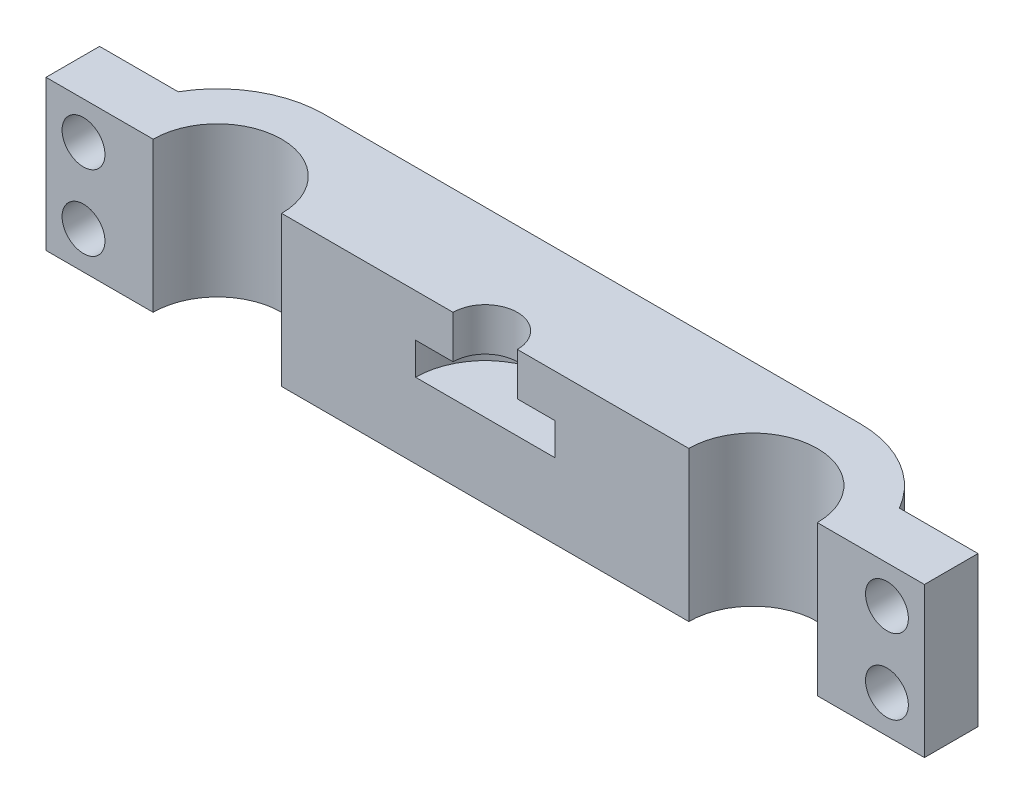
ISO-10303-21;
HEADER;
FILE_DESCRIPTION(('STEP AP214'),'2;1');
FILE_NAME('part.step','',(''),(''),'','','');
FILE_SCHEMA(('AUTOMOTIVE_DESIGN { 1 0 10303 214 1 1 1 1 }'));
ENDSEC;
DATA;
#1=APPLICATION_CONTEXT('core data for automotive mechanical design processes');
#2=APPLICATION_PROTOCOL_DEFINITION('international standard','automotive_design',2000,#1);
#3=PRODUCT_CONTEXT('',#1,'mechanical');
#4=PRODUCT('Part','Part','',(#3));
#5=PRODUCT_RELATED_PRODUCT_CATEGORY('part','',(#4));
#6=PRODUCT_DEFINITION_FORMATION('','',#4);
#7=PRODUCT_DEFINITION_CONTEXT('part definition',#1,'design');
#8=PRODUCT_DEFINITION('design','',#6,#7);
#9=PRODUCT_DEFINITION_SHAPE('','',#8);
#10=(LENGTH_UNIT() NAMED_UNIT(*) SI_UNIT(.MILLI.,.METRE.));
#11=(NAMED_UNIT(*) PLANE_ANGLE_UNIT() SI_UNIT($,.RADIAN.));
#12=(NAMED_UNIT(*) SI_UNIT($,.STERADIAN.) SOLID_ANGLE_UNIT());
#13=UNCERTAINTY_MEASURE_WITH_UNIT(LENGTH_MEASURE(1.E-05),#10,'distance_accuracy_value','');
#14=(GEOMETRIC_REPRESENTATION_CONTEXT(3) GLOBAL_UNCERTAINTY_ASSIGNED_CONTEXT((#13)) GLOBAL_UNIT_ASSIGNED_CONTEXT((#10,
#11,#12)) REPRESENTATION_CONTEXT('',''));
#15=CARTESIAN_POINT('',(0.,0.,0.));
#16=DIRECTION('',(0.,0.,1.));
#17=DIRECTION('',(1.,0.,0.));
#18=AXIS2_PLACEMENT_3D('',#15,#16,#17);
#19=CARTESIAN_POINT('',(3.,14.,0.));
#20=DIRECTION('',(0.,0.,-1.));
#21=DIRECTION('',(-1.,0.,0.));
#22=AXIS2_PLACEMENT_3D('',#19,#20,#21);
#23=PLANE('',#22);
#24=DIRECTION('',(-1.,0.,0.));
#25=VECTOR('',#24,1.);
#26=CARTESIAN_POINT('',(-4.68331613752354,7.,0.));
#27=LINE('',#26,#25);
#28=CARTESIAN_POINT('',(6.5,7.,0.));
#29=VERTEX_POINT('',#28);
#30=CARTESIAN_POINT('',(-6.5,7.,0.));
#31=VERTEX_POINT('',#30);
#32=EDGE_CURVE('E278',#29,#31,#27,.T.);
#33=ORIENTED_EDGE('',*,*,#32,.T.);
#34=DIRECTION('',(0.,1.,0.));
#35=VECTOR('',#34,1.);
#36=CARTESIAN_POINT('',(-6.5,7.,0.));
#37=LINE('',#36,#35);
#38=CARTESIAN_POINT('',(-6.5,10.,0.));
#39=VERTEX_POINT('',#38);
#40=EDGE_CURVE('E11',#31,#39,#37,.T.);
#41=ORIENTED_EDGE('',*,*,#40,.T.);
#42=DIRECTION('',(1.,0.,0.));
#43=VECTOR('',#42,1.);
#44=CARTESIAN_POINT('',(3.,10.,0.));
#45=LINE('',#44,#43);
#46=CARTESIAN_POINT('',(-3.,10.,0.));
#47=VERTEX_POINT('',#46);
#48=EDGE_CURVE('E54',#39,#47,#45,.T.);
#49=ORIENTED_EDGE('',*,*,#48,.T.);
#50=DIRECTION('',(0.,-1.,0.));
#51=VECTOR('',#50,1.);
#52=CARTESIAN_POINT('',(-3.,14.,0.));
#53=LINE('',#52,#51);
#54=CARTESIAN_POINT('',(-3.,14.,0.));
#55=VERTEX_POINT('',#54);
#56=EDGE_CURVE('E241',#55,#47,#53,.T.);
#57=ORIENTED_EDGE('',*,*,#56,.F.);
#58=DIRECTION('',(1.,0.,0.));
#59=VECTOR('',#58,1.);
#60=CARTESIAN_POINT('',(-3.,14.,0.));
#61=LINE('',#60,#59);
#62=CARTESIAN_POINT('',(-19.,14.,0.));
#63=VERTEX_POINT('',#62);
#64=EDGE_CURVE('E321',#63,#55,#61,.T.);
#65=ORIENTED_EDGE('',*,*,#64,.F.);
#66=DIRECTION('',(0.,-1.,0.));
#67=VECTOR('',#66,1.);
#68=CARTESIAN_POINT('',(-19.,14.,0.));
#69=LINE('',#68,#67);
#70=CARTESIAN_POINT('',(-19.,0.,0.));
#71=VERTEX_POINT('',#70);
#72=EDGE_CURVE('E245',#63,#71,#69,.T.);
#73=ORIENTED_EDGE('',*,*,#72,.T.);
#74=DIRECTION('',(1.,0.,0.));
#75=VECTOR('',#74,1.);
#76=CARTESIAN_POINT('',(3.,0.,0.));
#77=LINE('',#76,#75);
#78=CARTESIAN_POINT('',(19.,0.,0.));
#79=VERTEX_POINT('',#78);
#80=EDGE_CURVE('E213',#71,#79,#77,.T.);
#81=ORIENTED_EDGE('',*,*,#80,.T.);
#82=DIRECTION('',(0.,-1.,0.));
#83=VECTOR('',#82,1.);
#84=CARTESIAN_POINT('',(19.,14.,0.));
#85=LINE('',#84,#83);
#86=CARTESIAN_POINT('',(19.,14.,0.));
#87=VERTEX_POINT('',#86);
#88=EDGE_CURVE('E233',#87,#79,#85,.T.);
#89=ORIENTED_EDGE('',*,*,#88,.F.);
#90=DIRECTION('',(1.,0.,0.));
#91=VECTOR('',#90,1.);
#92=CARTESIAN_POINT('',(3.,14.,0.));
#93=LINE('',#92,#91);
#94=CARTESIAN_POINT('',(3.,14.,0.));
#95=VERTEX_POINT('',#94);
#96=EDGE_CURVE('E320',#95,#87,#93,.T.);
#97=ORIENTED_EDGE('',*,*,#96,.F.);
#98=DIRECTION('',(0.,-1.,0.));
#99=VECTOR('',#98,1.);
#100=CARTESIAN_POINT('',(3.,14.,0.));
#101=LINE('',#100,#99);
#102=CARTESIAN_POINT('',(3.,10.,0.));
#103=VERTEX_POINT('',#102);
#104=EDGE_CURVE('E237',#95,#103,#101,.T.);
#105=ORIENTED_EDGE('',*,*,#104,.T.);
#106=CARTESIAN_POINT('',(6.5,10.,0.));
#107=VERTEX_POINT('',#106);
#108=EDGE_CURVE('E272',#103,#107,#45,.T.);
#109=ORIENTED_EDGE('',*,*,#108,.T.);
#110=DIRECTION('',(0.,1.,0.));
#111=VECTOR('',#110,1.);
#112=CARTESIAN_POINT('',(6.5,7.,0.));
#113=LINE('',#112,#111);
#114=EDGE_CURVE('E295',#107,#29,#113,.F.);
#115=ORIENTED_EDGE('',*,*,#114,.T.);
#116=EDGE_LOOP('',(#33,#41,#49,#57,#65,#73,#81,#89,#97,#105,#109,#115));
#117=FACE_BOUND('',#116,.T.);
#118=ADVANCED_FACE('F45',(#117),#23,.F.);
#119=CARTESIAN_POINT('',(25.,14.,0.));
#120=DIRECTION('',(0.,-1.,0.));
#121=DIRECTION('',(0.,0.,-1.));
#122=AXIS2_PLACEMENT_3D('',#119,#120,#121);
#123=CYLINDRICAL_SURFACE('',#122,10.);
#124=CARTESIAN_POINT('',(25.,0.,0.));
#125=DIRECTION('',(0.,1.,0.));
#126=DIRECTION('',(0.,0.,1.));
#127=AXIS2_PLACEMENT_3D('',#124,#125,#126);
#128=CIRCLE('',#127,10.);
#129=CARTESIAN_POINT('',(33.6602540378444,0.,-5.));
#130=VERTEX_POINT('',#129);
#131=CARTESIAN_POINT('',(25.,0.,-10.));
#132=VERTEX_POINT('',#131);
#133=EDGE_CURVE('E189',#130,#132,#128,.T.);
#134=ORIENTED_EDGE('',*,*,#133,.T.);
#135=DIRECTION('',(0.,-1.,0.));
#136=VECTOR('',#135,1.);
#137=CARTESIAN_POINT('',(25.,14.,-10.));
#138=LINE('',#137,#136);
#139=CARTESIAN_POINT('',(25.,14.,-10.));
#140=VERTEX_POINT('',#139);
#141=EDGE_CURVE('E269',#140,#132,#138,.T.);
#142=ORIENTED_EDGE('',*,*,#141,.F.);
#143=CARTESIAN_POINT('',(25.,14.,0.));
#144=DIRECTION('',(0.,1.,0.));
#145=DIRECTION('',(0.,0.,1.));
#146=AXIS2_PLACEMENT_3D('',#143,#144,#145);
#147=CIRCLE('',#146,10.);
#148=CARTESIAN_POINT('',(33.6602540378444,14.,-5.));
#149=VERTEX_POINT('',#148);
#150=EDGE_CURVE('E226',#149,#140,#147,.T.);
#151=ORIENTED_EDGE('',*,*,#150,.F.);
#152=DIRECTION('',(0.,-1.,0.));
#153=VECTOR('',#152,1.);
#154=CARTESIAN_POINT('',(33.6602540378444,14.,-5.));
#155=LINE('',#154,#153);
#156=EDGE_CURVE('E185',#149,#130,#155,.T.);
#157=ORIENTED_EDGE('',*,*,#156,.T.);
#158=EDGE_LOOP('',(#134,#142,#151,#157));
#159=FACE_BOUND('',#158,.T.);
#160=ADVANCED_FACE('F47',(#159),#123,.T.);
#161=CARTESIAN_POINT('',(-25.,14.,-10.));
#162=DIRECTION('',(0.,0.,1.));
#163=DIRECTION('',(1.,0.,0.));
#164=AXIS2_PLACEMENT_3D('',#161,#162,#163);
#165=PLANE('',#164);
#166=DIRECTION('',(-1.,0.,0.));
#167=VECTOR('',#166,1.);
#168=CARTESIAN_POINT('',(-25.,0.,-10.));
#169=LINE('',#168,#167);
#170=CARTESIAN_POINT('',(-25.,0.,-10.));
#171=VERTEX_POINT('',#170);
#172=EDGE_CURVE('E193',#132,#171,#169,.T.);
#173=ORIENTED_EDGE('',*,*,#172,.T.);
#174=DIRECTION('',(0.,-1.,0.));
#175=VECTOR('',#174,1.);
#176=CARTESIAN_POINT('',(-25.,14.,-10.));
#177=LINE('',#176,#175);
#178=CARTESIAN_POINT('',(-25.,14.,-10.));
#179=VERTEX_POINT('',#178);
#180=EDGE_CURVE('E265',#179,#171,#177,.T.);
#181=ORIENTED_EDGE('',*,*,#180,.F.);
#182=DIRECTION('',(-1.,0.,0.));
#183=VECTOR('',#182,1.);
#184=CARTESIAN_POINT('',(-25.,14.,-10.));
#185=LINE('',#184,#183);
#186=EDGE_CURVE('E124',#140,#179,#185,.T.);
#187=ORIENTED_EDGE('',*,*,#186,.F.);
#188=ORIENTED_EDGE('',*,*,#141,.T.);
#189=EDGE_LOOP('',(#173,#181,#187,#188));
#190=FACE_BOUND('',#189,.T.);
#191=ADVANCED_FACE('F391',(#190),#165,.F.);
#192=CARTESIAN_POINT('',(-25.,14.,0.));
#193=DIRECTION('',(0.,-1.,0.));
#194=DIRECTION('',(0.,0.,-1.));
#195=AXIS2_PLACEMENT_3D('',#192,#193,#194);
#196=CYLINDRICAL_SURFACE('',#195,10.);
#197=CARTESIAN_POINT('',(-25.,0.,0.));
#198=DIRECTION('',(0.,1.,0.));
#199=DIRECTION('',(0.,0.,1.));
#200=AXIS2_PLACEMENT_3D('',#197,#198,#199);
#201=CIRCLE('',#200,10.);
#202=CARTESIAN_POINT('',(-33.6602540378444,0.,-5.));
#203=VERTEX_POINT('',#202);
#204=EDGE_CURVE('E197',#171,#203,#201,.T.);
#205=ORIENTED_EDGE('',*,*,#204,.T.);
#206=DIRECTION('',(0.,-1.,0.));
#207=VECTOR('',#206,1.);
#208=CARTESIAN_POINT('',(-33.6602540378444,14.,-5.));
#209=LINE('',#208,#207);
#210=CARTESIAN_POINT('',(-33.6602540378444,14.,-5.));
#211=VERTEX_POINT('',#210);
#212=EDGE_CURVE('E261',#211,#203,#209,.T.);
#213=ORIENTED_EDGE('',*,*,#212,.F.);
#214=CARTESIAN_POINT('',(-25.,14.,0.));
#215=DIRECTION('',(0.,1.,0.));
#216=DIRECTION('',(0.,0.,1.));
#217=AXIS2_PLACEMENT_3D('',#214,#215,#216);
#218=CIRCLE('',#217,10.);
#219=EDGE_CURVE('E341',#179,#211,#218,.T.);
#220=ORIENTED_EDGE('',*,*,#219,.F.);
#221=ORIENTED_EDGE('',*,*,#180,.T.);
#222=EDGE_LOOP('',(#205,#213,#220,#221));
#223=FACE_BOUND('',#222,.T.);
#224=ADVANCED_FACE('F394',(#223),#196,.T.);
#225=CARTESIAN_POINT('',(-41.,14.,-5.));
#226=DIRECTION('',(0.,0.,1.));
#227=DIRECTION('',(1.,0.,0.));
#228=AXIS2_PLACEMENT_3D('',#225,#226,#227);
#229=PLANE('',#228);
#230=CARTESIAN_POINT('',(-37.5,3.5,-5.));
#231=DIRECTION('',(0.,0.,1.));
#232=DIRECTION('',(1.,0.,0.));
#233=AXIS2_PLACEMENT_3D('',#230,#231,#232);
#234=CIRCLE('',#233,2.);
#235=CARTESIAN_POINT('',(-35.5,3.5,-5.));
#236=VERTEX_POINT('',#235);
#237=EDGE_CURVE('E194',#236,#236,#234,.T.);
#238=ORIENTED_EDGE('',*,*,#237,.T.);
#239=EDGE_LOOP('',(#238));
#240=FACE_BOUND('',#239,.T.);
#241=CARTESIAN_POINT('',(-37.5,10.5,-5.));
#242=DIRECTION('',(0.,0.,1.));
#243=DIRECTION('',(1.,0.,0.));
#244=AXIS2_PLACEMENT_3D('',#241,#242,#243);
#245=CIRCLE('',#244,2.);
#246=CARTESIAN_POINT('',(-35.5,10.5,-5.));
#247=VERTEX_POINT('',#246);
#248=EDGE_CURVE('E288',#247,#247,#245,.T.);
#249=ORIENTED_EDGE('',*,*,#248,.T.);
#250=EDGE_LOOP('',(#249));
#251=FACE_BOUND('',#250,.T.);
#252=DIRECTION('',(-1.,0.,0.));
#253=VECTOR('',#252,1.);
#254=CARTESIAN_POINT('',(-41.,0.,-5.));
#255=LINE('',#254,#253);
#256=CARTESIAN_POINT('',(-41.,0.,-5.));
#257=VERTEX_POINT('',#256);
#258=EDGE_CURVE('E200',#203,#257,#255,.T.);
#259=ORIENTED_EDGE('',*,*,#258,.T.);
#260=DIRECTION('',(0.,-1.,0.));
#261=VECTOR('',#260,1.);
#262=CARTESIAN_POINT('',(-41.,14.,-5.));
#263=LINE('',#262,#261);
#264=CARTESIAN_POINT('',(-41.,14.,-5.));
#265=VERTEX_POINT('',#264);
#266=EDGE_CURVE('E257',#265,#257,#263,.T.);
#267=ORIENTED_EDGE('',*,*,#266,.F.);
#268=DIRECTION('',(-1.,0.,0.));
#269=VECTOR('',#268,1.);
#270=CARTESIAN_POINT('',(-41.,14.,-5.));
#271=LINE('',#270,#269);
#272=EDGE_CURVE('E338',#211,#265,#271,.T.);
#273=ORIENTED_EDGE('',*,*,#272,.F.);
#274=ORIENTED_EDGE('',*,*,#212,.T.);
#275=EDGE_LOOP('',(#259,#267,#273,#274));
#276=FACE_BOUND('',#275,.T.);
#277=ADVANCED_FACE('F399',(#240,#251,#276),#229,.F.);
#278=CARTESIAN_POINT('',(-41.,14.,0.));
#279=DIRECTION('',(1.,0.,0.));
#280=DIRECTION('',(0.,0.,-1.));
#281=AXIS2_PLACEMENT_3D('',#278,#279,#280);
#282=PLANE('',#281);
#283=DIRECTION('',(0.,0.,1.));
#284=VECTOR('',#283,1.);
#285=CARTESIAN_POINT('',(-41.,0.,0.));
#286=LINE('',#285,#284);
#287=CARTESIAN_POINT('',(-41.,0.,0.));
#288=VERTEX_POINT('',#287);
#289=EDGE_CURVE('E203',#257,#288,#286,.T.);
#290=ORIENTED_EDGE('',*,*,#289,.T.);
#291=DIRECTION('',(0.,-1.,0.));
#292=VECTOR('',#291,1.);
#293=CARTESIAN_POINT('',(-41.,14.,0.));
#294=LINE('',#293,#292);
#295=CARTESIAN_POINT('',(-41.,14.,0.));
#296=VERTEX_POINT('',#295);
#297=EDGE_CURVE('E253',#296,#288,#294,.T.);
#298=ORIENTED_EDGE('',*,*,#297,.F.);
#299=DIRECTION('',(0.,0.,1.));
#300=VECTOR('',#299,1.);
#301=CARTESIAN_POINT('',(-41.,14.,0.));
#302=LINE('',#301,#300);
#303=EDGE_CURVE('E335',#265,#296,#302,.T.);
#304=ORIENTED_EDGE('',*,*,#303,.F.);
#305=ORIENTED_EDGE('',*,*,#266,.T.);
#306=EDGE_LOOP('',(#290,#298,#304,#305));
#307=FACE_BOUND('',#306,.T.);
#308=ADVANCED_FACE('F405',(#307),#282,.F.);
#309=CARTESIAN_POINT('',(-31.,14.,0.));
#310=DIRECTION('',(0.,0.,-1.));
#311=DIRECTION('',(-1.,0.,0.));
#312=AXIS2_PLACEMENT_3D('',#309,#310,#311);
#313=PLANE('',#312);
#314=CARTESIAN_POINT('',(-37.5,3.5,0.));
#315=DIRECTION('',(0.,0.,-1.));
#316=DIRECTION('',(-1.,0.,0.));
#317=AXIS2_PLACEMENT_3D('',#314,#315,#316);
#318=CIRCLE('',#317,2.);
#319=CARTESIAN_POINT('',(-35.5,3.5,0.));
#320=VERTEX_POINT('',#319);
#321=EDGE_CURVE('E289',#320,#320,#318,.T.);
#322=ORIENTED_EDGE('',*,*,#321,.T.);
#323=EDGE_LOOP('',(#322));
#324=FACE_BOUND('',#323,.T.);
#325=CARTESIAN_POINT('',(-37.5,10.5,0.));
#326=DIRECTION('',(0.,0.,-1.));
#327=DIRECTION('',(-1.,0.,0.));
#328=AXIS2_PLACEMENT_3D('',#325,#326,#327);
#329=CIRCLE('',#328,2.);
#330=CARTESIAN_POINT('',(-35.5,10.5,0.));
#331=VERTEX_POINT('',#330);
#332=EDGE_CURVE('E284',#331,#331,#329,.T.);
#333=ORIENTED_EDGE('',*,*,#332,.T.);
#334=EDGE_LOOP('',(#333));
#335=FACE_BOUND('',#334,.T.);
#336=DIRECTION('',(1.,0.,0.));
#337=VECTOR('',#336,1.);
#338=CARTESIAN_POINT('',(-31.,0.,0.));
#339=LINE('',#338,#337);
#340=CARTESIAN_POINT('',(-31.,0.,0.));
#341=VERTEX_POINT('',#340);
#342=EDGE_CURVE('E206',#288,#341,#339,.T.);
#343=ORIENTED_EDGE('',*,*,#342,.T.);
#344=DIRECTION('',(0.,-1.,0.));
#345=VECTOR('',#344,1.);
#346=CARTESIAN_POINT('',(-31.,14.,0.));
#347=LINE('',#346,#345);
#348=CARTESIAN_POINT('',(-31.,14.,0.));
#349=VERTEX_POINT('',#348);
#350=EDGE_CURVE('E249',#349,#341,#347,.T.);
#351=ORIENTED_EDGE('',*,*,#350,.F.);
#352=DIRECTION('',(1.,0.,0.));
#353=VECTOR('',#352,1.);
#354=CARTESIAN_POINT('',(-31.,14.,0.));
#355=LINE('',#354,#353);
#356=EDGE_CURVE('E332',#296,#349,#355,.T.);
#357=ORIENTED_EDGE('',*,*,#356,.F.);
#358=ORIENTED_EDGE('',*,*,#297,.T.);
#359=EDGE_LOOP('',(#343,#351,#357,#358));
#360=FACE_BOUND('',#359,.T.);
#361=ADVANCED_FACE('F409',(#324,#335,#360),#313,.F.);
#362=CARTESIAN_POINT('',(-25.,14.,0.));
#363=DIRECTION('',(0.,-1.,0.));
#364=DIRECTION('',(0.,0.,-1.));
#365=AXIS2_PLACEMENT_3D('',#362,#363,#364);
#366=CYLINDRICAL_SURFACE('',#365,6.);
#367=CARTESIAN_POINT('',(-25.,0.,0.));
#368=DIRECTION('',(0.,-1.,0.));
#369=DIRECTION('',(0.,0.,1.));
#370=AXIS2_PLACEMENT_3D('',#367,#368,#369);
#371=CIRCLE('',#370,6.);
#372=EDGE_CURVE('E209',#341,#71,#371,.T.);
#373=ORIENTED_EDGE('',*,*,#372,.T.);
#374=ORIENTED_EDGE('',*,*,#72,.F.);
#375=CARTESIAN_POINT('',(-25.,14.,0.));
#376=DIRECTION('',(0.,-1.,0.));
#377=DIRECTION('',(0.,0.,1.));
#378=AXIS2_PLACEMENT_3D('',#375,#376,#377);
#379=CIRCLE('',#378,6.);
#380=EDGE_CURVE('E326',#349,#63,#379,.T.);
#381=ORIENTED_EDGE('',*,*,#380,.F.);
#382=ORIENTED_EDGE('',*,*,#350,.T.);
#383=EDGE_LOOP('',(#373,#374,#381,#382));
#384=FACE_BOUND('',#383,.T.);
#385=ADVANCED_FACE('F414',(#384),#366,.F.);
#386=CARTESIAN_POINT('',(0.,14.,0.));
#387=DIRECTION('',(0.,-1.,0.));
#388=DIRECTION('',(0.,0.,-1.));
#389=AXIS2_PLACEMENT_3D('',#386,#387,#388);
#390=CYLINDRICAL_SURFACE('',#389,3.);
#391=ORIENTED_EDGE('',*,*,#56,.T.);
#392=CARTESIAN_POINT('',(0.,10.,0.));
#393=DIRECTION('',(0.,1.,0.));
#394=DIRECTION('',(0.,0.,1.));
#395=AXIS2_PLACEMENT_3D('',#392,#393,#394);
#396=CIRCLE('',#395,3.);
#397=EDGE_CURVE('E316',#47,#103,#396,.F.);
#398=ORIENTED_EDGE('',*,*,#397,.T.);
#399=ORIENTED_EDGE('',*,*,#104,.F.);
#400=CARTESIAN_POINT('',(0.,14.,0.));
#401=DIRECTION('',(0.,-1.,0.));
#402=DIRECTION('',(0.,0.,1.));
#403=AXIS2_PLACEMENT_3D('',#400,#401,#402);
#404=CIRCLE('',#403,3.);
#405=EDGE_CURVE('E317',#55,#95,#404,.T.);
#406=ORIENTED_EDGE('',*,*,#405,.F.);
#407=EDGE_LOOP('',(#391,#398,#399,#406));
#408=FACE_BOUND('',#407,.T.);
#409=ADVANCED_FACE('F314',(#408),#390,.F.);
#410=CARTESIAN_POINT('',(25.,14.,0.));
#411=DIRECTION('',(0.,-1.,0.));
#412=DIRECTION('',(0.,0.,-1.));
#413=AXIS2_PLACEMENT_3D('',#410,#411,#412);
#414=CYLINDRICAL_SURFACE('',#413,6.);
#415=CARTESIAN_POINT('',(25.,0.,0.));
#416=DIRECTION('',(0.,-1.,0.));
#417=DIRECTION('',(0.,0.,1.));
#418=AXIS2_PLACEMENT_3D('',#415,#416,#417);
#419=CIRCLE('',#418,6.);
#420=CARTESIAN_POINT('',(31.,0.,0.));
#421=VERTEX_POINT('',#420);
#422=EDGE_CURVE('E216',#79,#421,#419,.T.);
#423=ORIENTED_EDGE('',*,*,#422,.T.);
#424=DIRECTION('',(0.,-1.,0.));
#425=VECTOR('',#424,1.);
#426=CARTESIAN_POINT('',(31.,14.,0.));
#427=LINE('',#426,#425);
#428=CARTESIAN_POINT('',(31.,14.,0.));
#429=VERTEX_POINT('',#428);
#430=EDGE_CURVE('E178',#429,#421,#427,.T.);
#431=ORIENTED_EDGE('',*,*,#430,.F.);
#432=CARTESIAN_POINT('',(25.,14.,0.));
#433=DIRECTION('',(0.,-1.,0.));
#434=DIRECTION('',(0.,0.,1.));
#435=AXIS2_PLACEMENT_3D('',#432,#433,#434);
#436=CIRCLE('',#435,6.);
#437=EDGE_CURVE('E164',#87,#429,#436,.T.);
#438=ORIENTED_EDGE('',*,*,#437,.F.);
#439=ORIENTED_EDGE('',*,*,#88,.T.);
#440=EDGE_LOOP('',(#423,#431,#438,#439));
#441=FACE_BOUND('',#440,.T.);
#442=ADVANCED_FACE('F381',(#441),#414,.F.);
#443=CARTESIAN_POINT('',(31.,14.,0.));
#444=DIRECTION('',(0.,0.,-1.));
#445=DIRECTION('',(-1.,0.,0.));
#446=AXIS2_PLACEMENT_3D('',#443,#444,#445);
#447=PLANE('',#446);
#448=CARTESIAN_POINT('',(37.5,10.5,0.));
#449=DIRECTION('',(0.,0.,-1.));
#450=DIRECTION('',(-1.,0.,0.));
#451=AXIS2_PLACEMENT_3D('',#448,#449,#450);
#452=CIRCLE('',#451,2.);
#453=CARTESIAN_POINT('',(39.5,10.5,0.));
#454=VERTEX_POINT('',#453);
#455=EDGE_CURVE('E283',#454,#454,#452,.T.);
#456=ORIENTED_EDGE('',*,*,#455,.T.);
#457=EDGE_LOOP('',(#456));
#458=FACE_BOUND('',#457,.T.);
#459=CARTESIAN_POINT('',(37.5,3.5,0.));
#460=DIRECTION('',(0.,0.,-1.));
#461=DIRECTION('',(-1.,0.,0.));
#462=AXIS2_PLACEMENT_3D('',#459,#460,#461);
#463=CIRCLE('',#462,2.);
#464=CARTESIAN_POINT('',(39.5,3.5,0.));
#465=VERTEX_POINT('',#464);
#466=EDGE_CURVE('E277',#465,#465,#463,.T.);
#467=ORIENTED_EDGE('',*,*,#466,.T.);
#468=EDGE_LOOP('',(#467));
#469=FACE_BOUND('',#468,.T.);
#470=DIRECTION('',(1.,0.,0.));
#471=VECTOR('',#470,1.);
#472=CARTESIAN_POINT('',(31.,0.,0.));
#473=LINE('',#472,#471);
#474=CARTESIAN_POINT('',(41.,0.,0.));
#475=VERTEX_POINT('',#474);
#476=EDGE_CURVE('E174',#421,#475,#473,.T.);
#477=ORIENTED_EDGE('',*,*,#476,.T.);
#478=DIRECTION('',(0.,-1.,0.));
#479=VECTOR('',#478,1.);
#480=CARTESIAN_POINT('',(41.,14.,0.));
#481=LINE('',#480,#479);
#482=CARTESIAN_POINT('',(41.,14.,0.));
#483=VERTEX_POINT('',#482);
#484=EDGE_CURVE('E171',#483,#475,#481,.T.);
#485=ORIENTED_EDGE('',*,*,#484,.F.);
#486=DIRECTION('',(1.,0.,0.));
#487=VECTOR('',#486,1.);
#488=CARTESIAN_POINT('',(31.,14.,0.));
#489=LINE('',#488,#487);
#490=EDGE_CURVE('E157',#429,#483,#489,.T.);
#491=ORIENTED_EDGE('',*,*,#490,.F.);
#492=ORIENTED_EDGE('',*,*,#430,.T.);
#493=EDGE_LOOP('',(#477,#485,#491,#492));
#494=FACE_BOUND('',#493,.T.);
#495=ADVANCED_FACE('F172',(#458,#469,#494),#447,.F.);
#496=CARTESIAN_POINT('',(41.,14.,0.));
#497=DIRECTION('',(-1.,0.,0.));
#498=DIRECTION('',(0.,0.,1.));
#499=AXIS2_PLACEMENT_3D('',#496,#497,#498);
#500=PLANE('',#499);
#501=DIRECTION('',(0.,0.,-1.));
#502=VECTOR('',#501,1.);
#503=CARTESIAN_POINT('',(41.,0.,0.));
#504=LINE('',#503,#502);
#505=CARTESIAN_POINT('',(41.,0.,-5.));
#506=VERTEX_POINT('',#505);
#507=EDGE_CURVE('E221',#475,#506,#504,.T.);
#508=ORIENTED_EDGE('',*,*,#507,.T.);
#509=DIRECTION('',(0.,-1.,0.));
#510=VECTOR('',#509,1.);
#511=CARTESIAN_POINT('',(41.,14.,-5.));
#512=LINE('',#511,#510);
#513=CARTESIAN_POINT('',(41.,14.,-5.));
#514=VERTEX_POINT('',#513);
#515=EDGE_CURVE('E179',#514,#506,#512,.T.);
#516=ORIENTED_EDGE('',*,*,#515,.F.);
#517=DIRECTION('',(0.,0.,-1.));
#518=VECTOR('',#517,1.);
#519=CARTESIAN_POINT('',(41.,14.,0.));
#520=LINE('',#519,#518);
#521=EDGE_CURVE('E161',#483,#514,#520,.T.);
#522=ORIENTED_EDGE('',*,*,#521,.F.);
#523=ORIENTED_EDGE('',*,*,#484,.T.);
#524=EDGE_LOOP('',(#508,#516,#522,#523));
#525=FACE_BOUND('',#524,.T.);
#526=ADVANCED_FACE('F181',(#525),#500,.F.);
#527=CARTESIAN_POINT('',(41.,14.,-5.));
#528=DIRECTION('',(0.,0.,1.));
#529=DIRECTION('',(1.,0.,0.));
#530=AXIS2_PLACEMENT_3D('',#527,#528,#529);
#531=PLANE('',#530);
#532=CARTESIAN_POINT('',(37.5,10.5,-5.));
#533=DIRECTION('',(0.,0.,1.));
#534=DIRECTION('',(1.,0.,0.));
#535=AXIS2_PLACEMENT_3D('',#532,#533,#534);
#536=CIRCLE('',#535,2.);
#537=CARTESIAN_POINT('',(39.5,10.5,-5.));
#538=VERTEX_POINT('',#537);
#539=EDGE_CURVE('E279',#538,#538,#536,.T.);
#540=ORIENTED_EDGE('',*,*,#539,.T.);
#541=EDGE_LOOP('',(#540));
#542=FACE_BOUND('',#541,.T.);
#543=CARTESIAN_POINT('',(37.5,3.5,-5.));
#544=DIRECTION('',(0.,0.,1.));
#545=DIRECTION('',(1.,0.,0.));
#546=AXIS2_PLACEMENT_3D('',#543,#544,#545);
#547=CIRCLE('',#546,2.);
#548=CARTESIAN_POINT('',(39.5,3.5,-5.));
#549=VERTEX_POINT('',#548);
#550=EDGE_CURVE('E273',#549,#549,#547,.T.);
#551=ORIENTED_EDGE('',*,*,#550,.T.);
#552=EDGE_LOOP('',(#551));
#553=FACE_BOUND('',#552,.T.);
#554=DIRECTION('',(-1.,0.,0.));
#555=VECTOR('',#554,1.);
#556=CARTESIAN_POINT('',(41.,0.,-5.));
#557=LINE('',#556,#555);
#558=EDGE_CURVE('E115',#506,#130,#557,.T.);
#559=ORIENTED_EDGE('',*,*,#558,.T.);
#560=ORIENTED_EDGE('',*,*,#156,.F.);
#561=DIRECTION('',(-1.,0.,0.));
#562=VECTOR('',#561,1.);
#563=CARTESIAN_POINT('',(41.,14.,-5.));
#564=LINE('',#563,#562);
#565=EDGE_CURVE('E70',#514,#149,#564,.T.);
#566=ORIENTED_EDGE('',*,*,#565,.F.);
#567=ORIENTED_EDGE('',*,*,#515,.T.);
#568=EDGE_LOOP('',(#559,#560,#566,#567));
#569=FACE_BOUND('',#568,.T.);
#570=ADVANCED_FACE('F385',(#542,#553,#569),#531,.F.);
#571=CARTESIAN_POINT('',(25.,14.,0.));
#572=DIRECTION('',(0.,1.,0.));
#573=DIRECTION('',(0.,0.,1.));
#574=AXIS2_PLACEMENT_3D('',#571,#572,#573);
#575=PLANE('',#574);
#576=ORIENTED_EDGE('',*,*,#150,.T.);
#577=ORIENTED_EDGE('',*,*,#186,.T.);
#578=ORIENTED_EDGE('',*,*,#219,.T.);
#579=ORIENTED_EDGE('',*,*,#272,.T.);
#580=ORIENTED_EDGE('',*,*,#303,.T.);
#581=ORIENTED_EDGE('',*,*,#356,.T.);
#582=ORIENTED_EDGE('',*,*,#380,.T.);
#583=ORIENTED_EDGE('',*,*,#64,.T.);
#584=ORIENTED_EDGE('',*,*,#405,.T.);
#585=ORIENTED_EDGE('',*,*,#96,.T.);
#586=ORIENTED_EDGE('',*,*,#437,.T.);
#587=ORIENTED_EDGE('',*,*,#490,.T.);
#588=ORIENTED_EDGE('',*,*,#521,.T.);
#589=ORIENTED_EDGE('',*,*,#565,.T.);
#590=EDGE_LOOP('',(#576,#577,#578,#579,#580,#581,#582,#583,#584,#585,#586,#587,#588,#589));
#591=FACE_BOUND('',#590,.T.);
#592=ADVANCED_FACE('F159',(#591),#575,.T.);
#593=CARTESIAN_POINT('',(25.,0.,0.));
#594=DIRECTION('',(0.,1.,0.));
#595=DIRECTION('',(0.,0.,1.));
#596=AXIS2_PLACEMENT_3D('',#593,#594,#595);
#597=PLANE('',#596);
#598=ORIENTED_EDGE('',*,*,#80,.F.);
#599=ORIENTED_EDGE('',*,*,#372,.F.);
#600=ORIENTED_EDGE('',*,*,#342,.F.);
#601=ORIENTED_EDGE('',*,*,#289,.F.);
#602=ORIENTED_EDGE('',*,*,#258,.F.);
#603=ORIENTED_EDGE('',*,*,#204,.F.);
#604=ORIENTED_EDGE('',*,*,#172,.F.);
#605=ORIENTED_EDGE('',*,*,#133,.F.);
#606=ORIENTED_EDGE('',*,*,#558,.F.);
#607=ORIENTED_EDGE('',*,*,#507,.F.);
#608=ORIENTED_EDGE('',*,*,#476,.F.);
#609=ORIENTED_EDGE('',*,*,#422,.F.);
#610=EDGE_LOOP('',(#598,#599,#600,#601,#602,#603,#604,#605,#606,#607,#608,#609));
#611=FACE_BOUND('',#610,.T.);
#612=ADVANCED_FACE('F383',(#611),#597,.F.);
#613=CARTESIAN_POINT('',(37.5,3.5,-10.));
#614=DIRECTION('',(0.,0.,1.));
#615=DIRECTION('',(1.,0.,0.));
#616=AXIS2_PLACEMENT_3D('',#613,#614,#615);
#617=CYLINDRICAL_SURFACE('',#616,2.);
#618=CARTESIAN_POINT('',(39.5,3.5,-5.));
#619=CARTESIAN_POINT('',(39.5,3.5,-4.94791666666667));
#620=CARTESIAN_POINT('',(39.5,3.5,-4.89583333333333));
#621=CARTESIAN_POINT('',(39.5,3.5,-4.79166666666667));
#622=CARTESIAN_POINT('',(39.5,3.5,-4.73958333333333));
#623=CARTESIAN_POINT('',(39.5,3.5,-4.63541666666667));
#624=CARTESIAN_POINT('',(39.5,3.5,-4.58333333333333));
#625=CARTESIAN_POINT('',(39.5,3.5,-4.47916666666667));
#626=CARTESIAN_POINT('',(39.5,3.5,-4.42708333333333));
#627=CARTESIAN_POINT('',(39.5,3.5,-4.32291666666667));
#628=CARTESIAN_POINT('',(39.5,3.5,-4.27083333333333));
#629=CARTESIAN_POINT('',(39.5,3.5,-4.16666666666667));
#630=CARTESIAN_POINT('',(39.5,3.5,-4.11458333333333));
#631=CARTESIAN_POINT('',(39.5,3.5,-4.01041666666667));
#632=CARTESIAN_POINT('',(39.5,3.5,-3.95833333333333));
#633=CARTESIAN_POINT('',(39.5,3.5,-3.85416666666667));
#634=CARTESIAN_POINT('',(39.5,3.5,-3.80208333333333));
#635=CARTESIAN_POINT('',(39.5,3.5,-3.69791666666667));
#636=CARTESIAN_POINT('',(39.5,3.5,-3.64583333333333));
#637=CARTESIAN_POINT('',(39.5,3.5,-3.54166666666667));
#638=CARTESIAN_POINT('',(39.5,3.5,-3.48958333333333));
#639=CARTESIAN_POINT('',(39.5,3.5,-3.38541666666667));
#640=CARTESIAN_POINT('',(39.5,3.5,-3.33333333333333));
#641=CARTESIAN_POINT('',(39.5,3.5,-3.22916666666667));
#642=CARTESIAN_POINT('',(39.5,3.5,-3.17708333333333));
#643=CARTESIAN_POINT('',(39.5,3.5,-3.07291666666667));
#644=CARTESIAN_POINT('',(39.5,3.5,-3.02083333333333));
#645=CARTESIAN_POINT('',(39.5,3.5,-2.91666666666667));
#646=CARTESIAN_POINT('',(39.5,3.5,-2.86458333333333));
#647=CARTESIAN_POINT('',(39.5,3.5,-2.76041666666667));
#648=CARTESIAN_POINT('',(39.5,3.5,-2.70833333333333));
#649=CARTESIAN_POINT('',(39.5,3.5,-2.60416666666667));
#650=CARTESIAN_POINT('',(39.5,3.5,-2.55208333333333));
#651=CARTESIAN_POINT('',(39.5,3.5,-2.44791666666667));
#652=CARTESIAN_POINT('',(39.5,3.5,-2.39583333333333));
#653=CARTESIAN_POINT('',(39.5,3.5,-2.29166666666667));
#654=CARTESIAN_POINT('',(39.5,3.5,-2.23958333333333));
#655=CARTESIAN_POINT('',(39.5,3.5,-2.13541666666667));
#656=CARTESIAN_POINT('',(39.5,3.5,-2.08333333333333));
#657=CARTESIAN_POINT('',(39.5,3.5,-1.97916666666667));
#658=CARTESIAN_POINT('',(39.5,3.5,-1.92708333333333));
#659=CARTESIAN_POINT('',(39.5,3.5,-1.82291666666667));
#660=CARTESIAN_POINT('',(39.5,3.5,-1.77083333333333));
#661=CARTESIAN_POINT('',(39.5,3.5,-1.66666666666667));
#662=CARTESIAN_POINT('',(39.5,3.5,-1.61458333333333));
#663=CARTESIAN_POINT('',(39.5,3.5,-1.51041666666667));
#664=CARTESIAN_POINT('',(39.5,3.5,-1.45833333333333));
#665=CARTESIAN_POINT('',(39.5,3.5,-1.35416666666667));
#666=CARTESIAN_POINT('',(39.5,3.5,-1.30208333333333));
#667=CARTESIAN_POINT('',(39.5,3.5,-1.19791666666667));
#668=CARTESIAN_POINT('',(39.5,3.5,-1.14583333333333));
#669=CARTESIAN_POINT('',(39.5,3.5,-1.04166666666667));
#670=CARTESIAN_POINT('',(39.5,3.5,-0.989583333333334));
#671=CARTESIAN_POINT('',(39.5,3.5,-0.885416666666668));
#672=CARTESIAN_POINT('',(39.5,3.5,-0.833333333333334));
#673=CARTESIAN_POINT('',(39.5,3.5,-0.729166666666667));
#674=CARTESIAN_POINT('',(39.5,3.5,-0.677083333333334));
#675=CARTESIAN_POINT('',(39.5,3.5,-0.572916666666667));
#676=CARTESIAN_POINT('',(39.5,3.5,-0.520833333333334));
#677=CARTESIAN_POINT('',(39.5,3.5,-0.416666666666667));
#678=CARTESIAN_POINT('',(39.5,3.5,-0.364583333333334));
#679=CARTESIAN_POINT('',(39.5,3.5,-0.260416666666667));
#680=CARTESIAN_POINT('',(39.5,3.5,-0.208333333333333));
#681=CARTESIAN_POINT('',(39.5,3.5,-0.104166666666667));
#682=CARTESIAN_POINT('',(39.5,3.5,-0.0520833333333334));
#683=CARTESIAN_POINT('',(39.5,3.5,0.));
#684=B_SPLINE_CURVE_WITH_KNOTS('',3,(#618,#619,#620,#621,#622,#623,#624,#625,#626,#627,#628,
#629,#630,#631,#632,#633,#634,#635,#636,#637,#638,#639,#640,#641,#642,#643,#644,#645,#646,#647,
#648,#649,#650,#651,#652,#653,#654,#655,#656,#657,#658,#659,#660,#661,#662,#663,#664,#665,#666,
#667,#668,#669,#670,#671,#672,#673,#674,#675,#676,#677,#678,#679,#680,#681,#682,#683),
.UNSPECIFIED.,.F.,.F.,(4,2,2,2,2,2,2,2,2,2,2,2,2,2,2,2,2,2,2,2,2,2,2,2,2,2,2,2,2,2,2,2,4),(0.,
0.15625,0.3125,0.46875,0.625000000000001,0.78125,0.9375,1.09375,1.25,1.40625,1.5625,1.71875,
1.875,2.03125,2.1875,2.34375,2.5,2.65625,2.8125,2.96875,3.125,3.28125,3.4375,3.59375,3.75,
3.90625,4.0625,4.21875,4.375,4.53125,4.6875,4.84375,5.),.UNSPECIFIED.);
#685=EDGE_CURVE('BSEAM443',#549,#465,#684,.T.);
#686=ORIENTED_EDGE('',*,*,#550,.F.);
#687=ORIENTED_EDGE('',*,*,#466,.F.);
#688=ORIENTED_EDGE('',*,*,#685,.T.);
#689=ORIENTED_EDGE('',*,*,#685,.F.);
#690=EDGE_LOOP('',(#686,#688,#687,#689));
#691=FACE_BOUND('',#690,.T.);
#692=ADVANCED_FACE('F443',(#691),#617,.F.);
#693=CARTESIAN_POINT('',(37.5,10.5,-10.));
#694=DIRECTION('',(0.,0.,1.));
#695=DIRECTION('',(1.,0.,0.));
#696=AXIS2_PLACEMENT_3D('',#693,#694,#695);
#697=CYLINDRICAL_SURFACE('',#696,2.);
#698=CARTESIAN_POINT('',(39.5,10.5,-5.));
#699=CARTESIAN_POINT('',(39.5,10.5,-4.94791666666667));
#700=CARTESIAN_POINT('',(39.5,10.5,-4.89583333333333));
#701=CARTESIAN_POINT('',(39.5,10.5,-4.79166666666667));
#702=CARTESIAN_POINT('',(39.5,10.5,-4.73958333333333));
#703=CARTESIAN_POINT('',(39.5,10.5,-4.63541666666667));
#704=CARTESIAN_POINT('',(39.5,10.5,-4.58333333333333));
#705=CARTESIAN_POINT('',(39.5,10.5,-4.47916666666667));
#706=CARTESIAN_POINT('',(39.5,10.5,-4.42708333333333));
#707=CARTESIAN_POINT('',(39.5,10.5,-4.32291666666667));
#708=CARTESIAN_POINT('',(39.5,10.5,-4.27083333333333));
#709=CARTESIAN_POINT('',(39.5,10.5,-4.16666666666667));
#710=CARTESIAN_POINT('',(39.5,10.5,-4.11458333333333));
#711=CARTESIAN_POINT('',(39.5,10.5,-4.01041666666667));
#712=CARTESIAN_POINT('',(39.5,10.5,-3.95833333333333));
#713=CARTESIAN_POINT('',(39.5,10.5,-3.85416666666667));
#714=CARTESIAN_POINT('',(39.5,10.5,-3.80208333333333));
#715=CARTESIAN_POINT('',(39.5,10.5,-3.69791666666667));
#716=CARTESIAN_POINT('',(39.5,10.5,-3.64583333333333));
#717=CARTESIAN_POINT('',(39.5,10.5,-3.54166666666667));
#718=CARTESIAN_POINT('',(39.5,10.5,-3.48958333333333));
#719=CARTESIAN_POINT('',(39.5,10.5,-3.38541666666667));
#720=CARTESIAN_POINT('',(39.5,10.5,-3.33333333333333));
#721=CARTESIAN_POINT('',(39.5,10.5,-3.22916666666667));
#722=CARTESIAN_POINT('',(39.5,10.5,-3.17708333333333));
#723=CARTESIAN_POINT('',(39.5,10.5,-3.07291666666667));
#724=CARTESIAN_POINT('',(39.5,10.5,-3.02083333333333));
#725=CARTESIAN_POINT('',(39.5,10.5,-2.91666666666667));
#726=CARTESIAN_POINT('',(39.5,10.5,-2.86458333333333));
#727=CARTESIAN_POINT('',(39.5,10.5,-2.76041666666667));
#728=CARTESIAN_POINT('',(39.5,10.5,-2.70833333333333));
#729=CARTESIAN_POINT('',(39.5,10.5,-2.60416666666667));
#730=CARTESIAN_POINT('',(39.5,10.5,-2.55208333333333));
#731=CARTESIAN_POINT('',(39.5,10.5,-2.44791666666667));
#732=CARTESIAN_POINT('',(39.5,10.5,-2.39583333333333));
#733=CARTESIAN_POINT('',(39.5,10.5,-2.29166666666667));
#734=CARTESIAN_POINT('',(39.5,10.5,-2.23958333333333));
#735=CARTESIAN_POINT('',(39.5,10.5,-2.13541666666667));
#736=CARTESIAN_POINT('',(39.5,10.5,-2.08333333333333));
#737=CARTESIAN_POINT('',(39.5,10.5,-1.97916666666667));
#738=CARTESIAN_POINT('',(39.5,10.5,-1.92708333333333));
#739=CARTESIAN_POINT('',(39.5,10.5,-1.82291666666667));
#740=CARTESIAN_POINT('',(39.5,10.5,-1.77083333333333));
#741=CARTESIAN_POINT('',(39.5,10.5,-1.66666666666667));
#742=CARTESIAN_POINT('',(39.5,10.5,-1.61458333333333));
#743=CARTESIAN_POINT('',(39.5,10.5,-1.51041666666667));
#744=CARTESIAN_POINT('',(39.5,10.5,-1.45833333333333));
#745=CARTESIAN_POINT('',(39.5,10.5,-1.35416666666667));
#746=CARTESIAN_POINT('',(39.5,10.5,-1.30208333333333));
#747=CARTESIAN_POINT('',(39.5,10.5,-1.19791666666667));
#748=CARTESIAN_POINT('',(39.5,10.5,-1.14583333333333));
#749=CARTESIAN_POINT('',(39.5,10.5,-1.04166666666667));
#750=CARTESIAN_POINT('',(39.5,10.5,-0.989583333333334));
#751=CARTESIAN_POINT('',(39.5,10.5,-0.885416666666668));
#752=CARTESIAN_POINT('',(39.5,10.5,-0.833333333333334));
#753=CARTESIAN_POINT('',(39.5,10.5,-0.729166666666667));
#754=CARTESIAN_POINT('',(39.5,10.5,-0.677083333333334));
#755=CARTESIAN_POINT('',(39.5,10.5,-0.572916666666667));
#756=CARTESIAN_POINT('',(39.5,10.5,-0.520833333333334));
#757=CARTESIAN_POINT('',(39.5,10.5,-0.416666666666667));
#758=CARTESIAN_POINT('',(39.5,10.5,-0.364583333333334));
#759=CARTESIAN_POINT('',(39.5,10.5,-0.260416666666667));
#760=CARTESIAN_POINT('',(39.5,10.5,-0.208333333333333));
#761=CARTESIAN_POINT('',(39.5,10.5,-0.104166666666667));
#762=CARTESIAN_POINT('',(39.5,10.5,-0.0520833333333334));
#763=CARTESIAN_POINT('',(39.5,10.5,0.));
#764=B_SPLINE_CURVE_WITH_KNOTS('',3,(#698,#699,#700,#701,#702,#703,#704,#705,#706,#707,#708,
#709,#710,#711,#712,#713,#714,#715,#716,#717,#718,#719,#720,#721,#722,#723,#724,#725,#726,#727,
#728,#729,#730,#731,#732,#733,#734,#735,#736,#737,#738,#739,#740,#741,#742,#743,#744,#745,#746,
#747,#748,#749,#750,#751,#752,#753,#754,#755,#756,#757,#758,#759,#760,#761,#762,#763),
.UNSPECIFIED.,.F.,.F.,(4,2,2,2,2,2,2,2,2,2,2,2,2,2,2,2,2,2,2,2,2,2,2,2,2,2,2,2,2,2,2,2,4),(0.,
0.15625,0.3125,0.46875,0.625000000000001,0.78125,0.9375,1.09375,1.25,1.40625,1.5625,1.71875,
1.875,2.03125,2.1875,2.34375,2.5,2.65625,2.8125,2.96875,3.125,3.28125,3.4375,3.59375,3.75,
3.90625,4.0625,4.21875,4.375,4.53125,4.6875,4.84375,5.),.UNSPECIFIED.);
#765=EDGE_CURVE('BSEAM450',#538,#454,#764,.T.);
#766=ORIENTED_EDGE('',*,*,#539,.F.);
#767=ORIENTED_EDGE('',*,*,#455,.F.);
#768=ORIENTED_EDGE('',*,*,#765,.T.);
#769=ORIENTED_EDGE('',*,*,#765,.F.);
#770=EDGE_LOOP('',(#766,#768,#767,#769));
#771=FACE_BOUND('',#770,.T.);
#772=ADVANCED_FACE('F450',(#771),#697,.F.);
#773=CARTESIAN_POINT('',(-37.5,10.5,-10.));
#774=DIRECTION('',(0.,0.,1.));
#775=DIRECTION('',(1.,0.,0.));
#776=AXIS2_PLACEMENT_3D('',#773,#774,#775);
#777=CYLINDRICAL_SURFACE('',#776,2.);
#778=CARTESIAN_POINT('',(-35.5,10.5,0.));
#779=CARTESIAN_POINT('',(-35.5,10.5,-0.0520833333333334));
#780=CARTESIAN_POINT('',(-35.5,10.5,-0.104166666666667));
#781=CARTESIAN_POINT('',(-35.5,10.5,-0.208333333333334));
#782=CARTESIAN_POINT('',(-35.5,10.5,-0.260416666666667));
#783=CARTESIAN_POINT('',(-35.5,10.5,-0.364583333333334));
#784=CARTESIAN_POINT('',(-35.5,10.5,-0.416666666666667));
#785=CARTESIAN_POINT('',(-35.5,10.5,-0.520833333333334));
#786=CARTESIAN_POINT('',(-35.5,10.5,-0.572916666666667));
#787=CARTESIAN_POINT('',(-35.5,10.5,-0.677083333333334));
#788=CARTESIAN_POINT('',(-35.5,10.5,-0.729166666666667));
#789=CARTESIAN_POINT('',(-35.5,10.5,-0.833333333333333));
#790=CARTESIAN_POINT('',(-35.5,10.5,-0.885416666666666));
#791=CARTESIAN_POINT('',(-35.5,10.5,-0.989583333333333));
#792=CARTESIAN_POINT('',(-35.5,10.5,-1.04166666666667));
#793=CARTESIAN_POINT('',(-35.5,10.5,-1.14583333333333));
#794=CARTESIAN_POINT('',(-35.5,10.5,-1.19791666666667));
#795=CARTESIAN_POINT('',(-35.5,10.5,-1.30208333333333));
#796=CARTESIAN_POINT('',(-35.5,10.5,-1.35416666666667));
#797=CARTESIAN_POINT('',(-35.5,10.5,-1.45833333333333));
#798=CARTESIAN_POINT('',(-35.5,10.5,-1.51041666666667));
#799=CARTESIAN_POINT('',(-35.5,10.5,-1.61458333333333));
#800=CARTESIAN_POINT('',(-35.5,10.5,-1.66666666666667));
#801=CARTESIAN_POINT('',(-35.5,10.5,-1.77083333333333));
#802=CARTESIAN_POINT('',(-35.5,10.5,-1.82291666666667));
#803=CARTESIAN_POINT('',(-35.5,10.5,-1.92708333333333));
#804=CARTESIAN_POINT('',(-35.5,10.5,-1.97916666666667));
#805=CARTESIAN_POINT('',(-35.5,10.5,-2.08333333333333));
#806=CARTESIAN_POINT('',(-35.5,10.5,-2.13541666666667));
#807=CARTESIAN_POINT('',(-35.5,10.5,-2.23958333333333));
#808=CARTESIAN_POINT('',(-35.5,10.5,-2.29166666666667));
#809=CARTESIAN_POINT('',(-35.5,10.5,-2.39583333333333));
#810=CARTESIAN_POINT('',(-35.5,10.5,-2.44791666666667));
#811=CARTESIAN_POINT('',(-35.5,10.5,-2.55208333333333));
#812=CARTESIAN_POINT('',(-35.5,10.5,-2.60416666666667));
#813=CARTESIAN_POINT('',(-35.5,10.5,-2.70833333333333));
#814=CARTESIAN_POINT('',(-35.5,10.5,-2.76041666666667));
#815=CARTESIAN_POINT('',(-35.5,10.5,-2.86458333333333));
#816=CARTESIAN_POINT('',(-35.5,10.5,-2.91666666666667));
#817=CARTESIAN_POINT('',(-35.5,10.5,-3.02083333333333));
#818=CARTESIAN_POINT('',(-35.5,10.5,-3.07291666666667));
#819=CARTESIAN_POINT('',(-35.5,10.5,-3.17708333333333));
#820=CARTESIAN_POINT('',(-35.5,10.5,-3.22916666666667));
#821=CARTESIAN_POINT('',(-35.5,10.5,-3.33333333333333));
#822=CARTESIAN_POINT('',(-35.5,10.5,-3.38541666666667));
#823=CARTESIAN_POINT('',(-35.5,10.5,-3.48958333333333));
#824=CARTESIAN_POINT('',(-35.5,10.5,-3.54166666666667));
#825=CARTESIAN_POINT('',(-35.5,10.5,-3.64583333333333));
#826=CARTESIAN_POINT('',(-35.5,10.5,-3.69791666666667));
#827=CARTESIAN_POINT('',(-35.5,10.5,-3.80208333333333));
#828=CARTESIAN_POINT('',(-35.5,10.5,-3.85416666666667));
#829=CARTESIAN_POINT('',(-35.5,10.5,-3.95833333333333));
#830=CARTESIAN_POINT('',(-35.5,10.5,-4.01041666666667));
#831=CARTESIAN_POINT('',(-35.5,10.5,-4.11458333333333));
#832=CARTESIAN_POINT('',(-35.5,10.5,-4.16666666666667));
#833=CARTESIAN_POINT('',(-35.5,10.5,-4.27083333333333));
#834=CARTESIAN_POINT('',(-35.5,10.5,-4.32291666666667));
#835=CARTESIAN_POINT('',(-35.5,10.5,-4.42708333333333));
#836=CARTESIAN_POINT('',(-35.5,10.5,-4.47916666666667));
#837=CARTESIAN_POINT('',(-35.5,10.5,-4.58333333333333));
#838=CARTESIAN_POINT('',(-35.5,10.5,-4.63541666666667));
#839=CARTESIAN_POINT('',(-35.5,10.5,-4.73958333333333));
#840=CARTESIAN_POINT('',(-35.5,10.5,-4.79166666666667));
#841=CARTESIAN_POINT('',(-35.5,10.5,-4.89583333333333));
#842=CARTESIAN_POINT('',(-35.5,10.5,-4.94791666666667));
#843=CARTESIAN_POINT('',(-35.5,10.5,-5.));
#844=B_SPLINE_CURVE_WITH_KNOTS('',3,(#778,#779,#780,#781,#782,#783,#784,#785,#786,#787,#788,
#789,#790,#791,#792,#793,#794,#795,#796,#797,#798,#799,#800,#801,#802,#803,#804,#805,#806,#807,
#808,#809,#810,#811,#812,#813,#814,#815,#816,#817,#818,#819,#820,#821,#822,#823,#824,#825,#826,
#827,#828,#829,#830,#831,#832,#833,#834,#835,#836,#837,#838,#839,#840,#841,#842,#843),
.UNSPECIFIED.,.F.,.F.,(4,2,2,2,2,2,2,2,2,2,2,2,2,2,2,2,2,2,2,2,2,2,2,2,2,2,2,2,2,2,2,2,4),(0.,
0.15625,0.3125,0.46875,0.625000000000001,0.781250000000001,0.937499999999999,1.09375,1.25,
1.40625,1.5625,1.71875,1.875,2.03125,2.1875,2.34375,2.5,2.65625,2.8125,2.96875,3.125,3.28125,
3.4375,3.59375,3.75,3.90625,4.0625,4.21875,4.375,4.53125,4.6875,4.84375,5.),.UNSPECIFIED.);
#845=EDGE_CURVE('BSEAM446',#331,#247,#844,.T.);
#846=ORIENTED_EDGE('',*,*,#332,.F.);
#847=ORIENTED_EDGE('',*,*,#248,.F.);
#848=ORIENTED_EDGE('',*,*,#845,.T.);
#849=ORIENTED_EDGE('',*,*,#845,.F.);
#850=EDGE_LOOP('',(#846,#848,#847,#849));
#851=FACE_BOUND('',#850,.T.);
#852=ADVANCED_FACE('F446',(#851),#777,.F.);
#853=CARTESIAN_POINT('',(-37.5,3.5,-10.));
#854=DIRECTION('',(0.,0.,1.));
#855=DIRECTION('',(1.,0.,0.));
#856=AXIS2_PLACEMENT_3D('',#853,#854,#855);
#857=CYLINDRICAL_SURFACE('',#856,2.);
#858=CARTESIAN_POINT('',(-35.5,3.5,0.));
#859=CARTESIAN_POINT('',(-35.5,3.5,-0.0520833333333334));
#860=CARTESIAN_POINT('',(-35.5,3.5,-0.104166666666667));
#861=CARTESIAN_POINT('',(-35.5,3.5,-0.208333333333334));
#862=CARTESIAN_POINT('',(-35.5,3.5,-0.260416666666667));
#863=CARTESIAN_POINT('',(-35.5,3.5,-0.364583333333334));
#864=CARTESIAN_POINT('',(-35.5,3.5,-0.416666666666667));
#865=CARTESIAN_POINT('',(-35.5,3.5,-0.520833333333334));
#866=CARTESIAN_POINT('',(-35.5,3.5,-0.572916666666667));
#867=CARTESIAN_POINT('',(-35.5,3.5,-0.677083333333334));
#868=CARTESIAN_POINT('',(-35.5,3.5,-0.729166666666667));
#869=CARTESIAN_POINT('',(-35.5,3.5,-0.833333333333333));
#870=CARTESIAN_POINT('',(-35.5,3.5,-0.885416666666666));
#871=CARTESIAN_POINT('',(-35.5,3.5,-0.989583333333333));
#872=CARTESIAN_POINT('',(-35.5,3.5,-1.04166666666667));
#873=CARTESIAN_POINT('',(-35.5,3.5,-1.14583333333333));
#874=CARTESIAN_POINT('',(-35.5,3.5,-1.19791666666667));
#875=CARTESIAN_POINT('',(-35.5,3.5,-1.30208333333333));
#876=CARTESIAN_POINT('',(-35.5,3.5,-1.35416666666667));
#877=CARTESIAN_POINT('',(-35.5,3.5,-1.45833333333333));
#878=CARTESIAN_POINT('',(-35.5,3.5,-1.51041666666667));
#879=CARTESIAN_POINT('',(-35.5,3.5,-1.61458333333333));
#880=CARTESIAN_POINT('',(-35.5,3.5,-1.66666666666667));
#881=CARTESIAN_POINT('',(-35.5,3.5,-1.77083333333333));
#882=CARTESIAN_POINT('',(-35.5,3.5,-1.82291666666667));
#883=CARTESIAN_POINT('',(-35.5,3.5,-1.92708333333333));
#884=CARTESIAN_POINT('',(-35.5,3.5,-1.97916666666667));
#885=CARTESIAN_POINT('',(-35.5,3.5,-2.08333333333333));
#886=CARTESIAN_POINT('',(-35.5,3.5,-2.13541666666667));
#887=CARTESIAN_POINT('',(-35.5,3.5,-2.23958333333333));
#888=CARTESIAN_POINT('',(-35.5,3.5,-2.29166666666667));
#889=CARTESIAN_POINT('',(-35.5,3.5,-2.39583333333333));
#890=CARTESIAN_POINT('',(-35.5,3.5,-2.44791666666667));
#891=CARTESIAN_POINT('',(-35.5,3.5,-2.55208333333333));
#892=CARTESIAN_POINT('',(-35.5,3.5,-2.60416666666667));
#893=CARTESIAN_POINT('',(-35.5,3.5,-2.70833333333333));
#894=CARTESIAN_POINT('',(-35.5,3.5,-2.76041666666667));
#895=CARTESIAN_POINT('',(-35.5,3.5,-2.86458333333333));
#896=CARTESIAN_POINT('',(-35.5,3.5,-2.91666666666667));
#897=CARTESIAN_POINT('',(-35.5,3.5,-3.02083333333333));
#898=CARTESIAN_POINT('',(-35.5,3.5,-3.07291666666667));
#899=CARTESIAN_POINT('',(-35.5,3.5,-3.17708333333333));
#900=CARTESIAN_POINT('',(-35.5,3.5,-3.22916666666667));
#901=CARTESIAN_POINT('',(-35.5,3.5,-3.33333333333333));
#902=CARTESIAN_POINT('',(-35.5,3.5,-3.38541666666667));
#903=CARTESIAN_POINT('',(-35.5,3.5,-3.48958333333333));
#904=CARTESIAN_POINT('',(-35.5,3.5,-3.54166666666667));
#905=CARTESIAN_POINT('',(-35.5,3.5,-3.64583333333333));
#906=CARTESIAN_POINT('',(-35.5,3.5,-3.69791666666667));
#907=CARTESIAN_POINT('',(-35.5,3.5,-3.80208333333333));
#908=CARTESIAN_POINT('',(-35.5,3.5,-3.85416666666667));
#909=CARTESIAN_POINT('',(-35.5,3.5,-3.95833333333333));
#910=CARTESIAN_POINT('',(-35.5,3.5,-4.01041666666667));
#911=CARTESIAN_POINT('',(-35.5,3.5,-4.11458333333333));
#912=CARTESIAN_POINT('',(-35.5,3.5,-4.16666666666667));
#913=CARTESIAN_POINT('',(-35.5,3.5,-4.27083333333333));
#914=CARTESIAN_POINT('',(-35.5,3.5,-4.32291666666667));
#915=CARTESIAN_POINT('',(-35.5,3.5,-4.42708333333333));
#916=CARTESIAN_POINT('',(-35.5,3.5,-4.47916666666667));
#917=CARTESIAN_POINT('',(-35.5,3.5,-4.58333333333333));
#918=CARTESIAN_POINT('',(-35.5,3.5,-4.63541666666667));
#919=CARTESIAN_POINT('',(-35.5,3.5,-4.73958333333333));
#920=CARTESIAN_POINT('',(-35.5,3.5,-4.79166666666667));
#921=CARTESIAN_POINT('',(-35.5,3.5,-4.89583333333333));
#922=CARTESIAN_POINT('',(-35.5,3.5,-4.94791666666667));
#923=CARTESIAN_POINT('',(-35.5,3.5,-5.));
#924=B_SPLINE_CURVE_WITH_KNOTS('',3,(#858,#859,#860,#861,#862,#863,#864,#865,#866,#867,#868,
#869,#870,#871,#872,#873,#874,#875,#876,#877,#878,#879,#880,#881,#882,#883,#884,#885,#886,#887,
#888,#889,#890,#891,#892,#893,#894,#895,#896,#897,#898,#899,#900,#901,#902,#903,#904,#905,#906,
#907,#908,#909,#910,#911,#912,#913,#914,#915,#916,#917,#918,#919,#920,#921,#922,#923),
.UNSPECIFIED.,.F.,.F.,(4,2,2,2,2,2,2,2,2,2,2,2,2,2,2,2,2,2,2,2,2,2,2,2,2,2,2,2,2,2,2,2,4),(0.,
0.15625,0.3125,0.46875,0.625000000000001,0.781250000000001,0.937499999999999,1.09375,1.25,
1.40625,1.5625,1.71875,1.875,2.03125,2.1875,2.34375,2.5,2.65625,2.8125,2.96875,3.125,3.28125,
3.4375,3.59375,3.75,3.90625,4.0625,4.21875,4.375,4.53125,4.6875,4.84375,5.),.UNSPECIFIED.);
#925=EDGE_CURVE('BSEAM449',#320,#236,#924,.T.);
#926=ORIENTED_EDGE('',*,*,#321,.F.);
#927=ORIENTED_EDGE('',*,*,#237,.F.);
#928=ORIENTED_EDGE('',*,*,#925,.T.);
#929=ORIENTED_EDGE('',*,*,#925,.F.);
#930=EDGE_LOOP('',(#926,#928,#927,#929));
#931=FACE_BOUND('',#930,.T.);
#932=ADVANCED_FACE('F449',(#931),#857,.F.);
#933=CARTESIAN_POINT('',(0.,7.,0.));
#934=DIRECTION('',(0.,1.,0.));
#935=DIRECTION('',(0.,0.,1.));
#936=AXIS2_PLACEMENT_3D('',#933,#934,#935);
#937=PLANE('',#936);
#938=ORIENTED_EDGE('',*,*,#32,.F.);
#939=CARTESIAN_POINT('',(0.,7.,0.));
#940=DIRECTION('',(0.,1.,0.));
#941=DIRECTION('',(0.,0.,1.));
#942=AXIS2_PLACEMENT_3D('',#939,#940,#941);
#943=CIRCLE('',#942,6.5);
#944=EDGE_CURVE('E364',#29,#31,#943,.T.);
#945=ORIENTED_EDGE('',*,*,#944,.T.);
#946=EDGE_LOOP('',(#938,#945));
#947=FACE_BOUND('',#946,.T.);
#948=ADVANCED_FACE('F372',(#947),#937,.T.);
#949=CARTESIAN_POINT('',(0.,7.,0.));
#950=DIRECTION('',(0.,1.,0.));
#951=DIRECTION('',(0.,0.,1.));
#952=AXIS2_PLACEMENT_3D('',#949,#950,#951);
#953=CYLINDRICAL_SURFACE('',#952,6.5);
#954=ORIENTED_EDGE('',*,*,#944,.F.);
#955=ORIENTED_EDGE('',*,*,#114,.F.);
#956=CARTESIAN_POINT('',(0.,10.,0.));
#957=DIRECTION('',(0.,1.,0.));
#958=DIRECTION('',(0.,0.,1.));
#959=AXIS2_PLACEMENT_3D('',#956,#957,#958);
#960=CIRCLE('',#959,6.5);
#961=EDGE_CURVE('E61',#107,#39,#960,.T.);
#962=ORIENTED_EDGE('',*,*,#961,.T.);
#963=ORIENTED_EDGE('',*,*,#40,.F.);
#964=EDGE_LOOP('',(#954,#955,#962,#963));
#965=FACE_BOUND('',#964,.T.);
#966=ADVANCED_FACE('F374',(#965),#953,.F.);
#967=CARTESIAN_POINT('',(0.,10.,0.));
#968=DIRECTION('',(0.,1.,0.));
#969=DIRECTION('',(0.,0.,1.));
#970=AXIS2_PLACEMENT_3D('',#967,#968,#969);
#971=PLANE('',#970);
#972=ORIENTED_EDGE('',*,*,#961,.F.);
#973=ORIENTED_EDGE('',*,*,#108,.F.);
#974=ORIENTED_EDGE('',*,*,#397,.F.);
#975=ORIENTED_EDGE('',*,*,#48,.F.);
#976=EDGE_LOOP('',(#972,#973,#974,#975));
#977=FACE_BOUND('',#976,.T.);
#978=ADVANCED_FACE('F377',(#977),#971,.F.);
#979=CLOSED_SHELL('',(#118,#160,#191,#224,#277,#308,#361,#385,#409,#442,#495,#526,#570,#592,
#612,#692,#772,#852,#932,#948,#966,#978));
#980=MANIFOLD_SOLID_BREP('B2',#979);
#981=ADVANCED_BREP_SHAPE_REPRESENTATION('',(#18,#980),#14);
#982=SHAPE_DEFINITION_REPRESENTATION(#9,#981);
ENDSEC;
END-ISO-10303-21;
